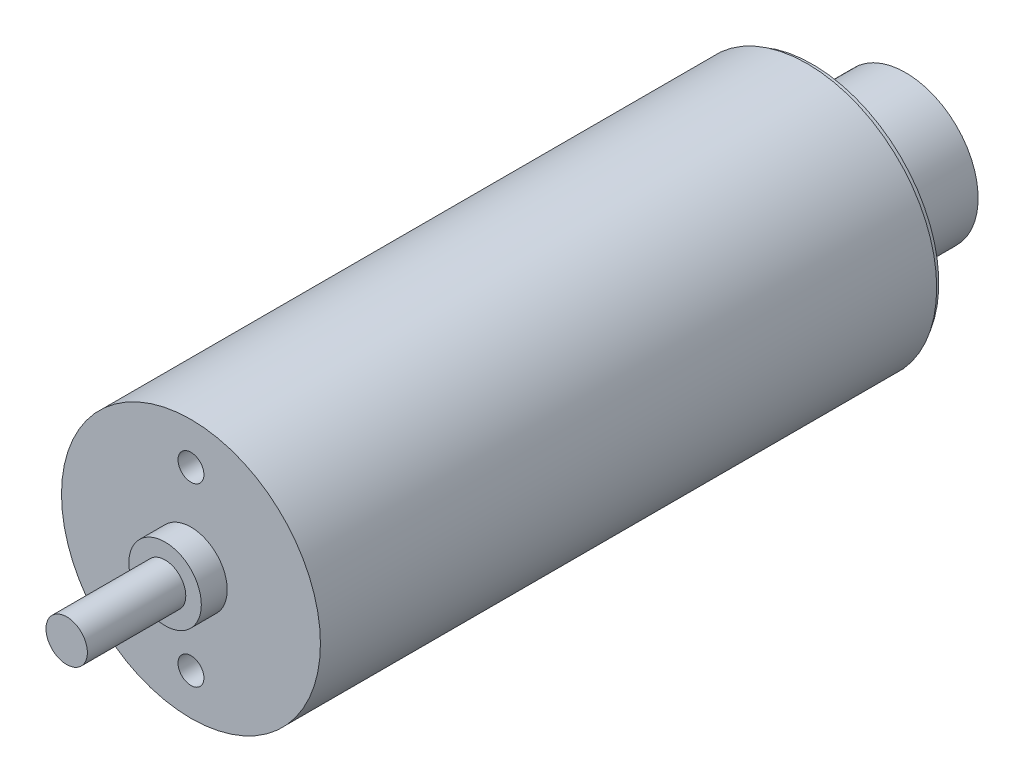
ISO-10303-21;
HEADER;
FILE_DESCRIPTION(('STEP AP214'),'2;1');
FILE_NAME('part.step','',(''),(''),'','','');
FILE_SCHEMA(('AUTOMOTIVE_DESIGN { 1 0 10303 214 1 1 1 1 }'));
ENDSEC;
DATA;
#1=APPLICATION_CONTEXT('core data for automotive mechanical design processes');
#2=APPLICATION_PROTOCOL_DEFINITION('international standard','automotive_design',2000,#1);
#3=PRODUCT_CONTEXT('',#1,'mechanical');
#4=PRODUCT('Part','Part','',(#3));
#5=PRODUCT_RELATED_PRODUCT_CATEGORY('part','',(#4));
#6=PRODUCT_DEFINITION_FORMATION('','',#4);
#7=PRODUCT_DEFINITION_CONTEXT('part definition',#1,'design');
#8=PRODUCT_DEFINITION('design','',#6,#7);
#9=PRODUCT_DEFINITION_SHAPE('','',#8);
#10=(LENGTH_UNIT() NAMED_UNIT(*) SI_UNIT(.MILLI.,.METRE.));
#11=(NAMED_UNIT(*) PLANE_ANGLE_UNIT() SI_UNIT($,.RADIAN.));
#12=(NAMED_UNIT(*) SI_UNIT($,.STERADIAN.) SOLID_ANGLE_UNIT());
#13=UNCERTAINTY_MEASURE_WITH_UNIT(LENGTH_MEASURE(1.E-05),#10,'distance_accuracy_value','');
#14=(GEOMETRIC_REPRESENTATION_CONTEXT(3) GLOBAL_UNCERTAINTY_ASSIGNED_CONTEXT((#13)) GLOBAL_UNIT_ASSIGNED_CONTEXT((#10,
#11,#12)) REPRESENTATION_CONTEXT('',''));
#15=CARTESIAN_POINT('',(0.,0.,0.));
#16=DIRECTION('',(0.,0.,1.));
#17=DIRECTION('',(1.,0.,0.));
#18=AXIS2_PLACEMENT_3D('',#15,#16,#17);
#19=CARTESIAN_POINT('',(0.,0.,-60.));
#20=DIRECTION('',(0.,0.,1.));
#21=DIRECTION('',(1.,0.,0.));
#22=AXIS2_PLACEMENT_3D('',#19,#20,#21);
#23=CYLINDRICAL_SURFACE('',#22,12.5);
#24=CARTESIAN_POINT('',(0.,0.,0.));
#25=DIRECTION('',(0.,0.,1.));
#26=DIRECTION('',(1.,0.,0.));
#27=AXIS2_PLACEMENT_3D('',#24,#25,#26);
#28=CIRCLE('',#27,12.5);
#29=CARTESIAN_POINT('',(12.5,0.,0.));
#30=VERTEX_POINT('',#29);
#31=EDGE_CURVE('E90',#30,#30,#28,.T.);
#32=ORIENTED_EDGE('',*,*,#31,.F.);
#33=EDGE_LOOP('',(#32));
#34=FACE_BOUND('',#33,.T.);
#35=CARTESIAN_POINT('',(0.,0.,-59.5));
#36=DIRECTION('',(0.,0.,-1.));
#37=DIRECTION('',(-1.,0.,0.));
#38=AXIS2_PLACEMENT_3D('',#35,#36,#37);
#39=CIRCLE('',#38,12.5);
#40=CARTESIAN_POINT('',(-12.5,0.,-59.5));
#41=VERTEX_POINT('',#40);
#42=EDGE_CURVE('E78',#41,#41,#39,.T.);
#43=ORIENTED_EDGE('',*,*,#42,.F.);
#44=EDGE_LOOP('',(#43));
#45=FACE_BOUND('',#44,.T.);
#46=ADVANCED_FACE('F46',(#34,#45),#23,.T.);
#47=CARTESIAN_POINT('',(0.,0.,0.));
#48=DIRECTION('',(0.,0.,1.));
#49=DIRECTION('',(1.,0.,0.));
#50=AXIS2_PLACEMENT_3D('',#47,#48,#49);
#51=PLANE('',#50);
#52=CARTESIAN_POINT('',(0.,8.5,0.));
#53=DIRECTION('',(0.,0.,1.));
#54=DIRECTION('',(1.,0.,0.));
#55=AXIS2_PLACEMENT_3D('',#52,#53,#54);
#56=CIRCLE('',#55,1.24999999999999);
#57=CARTESIAN_POINT('',(1.24999999999999,8.5,0.));
#58=VERTEX_POINT('',#57);
#59=EDGE_CURVE('E72',#58,#58,#56,.T.);
#60=ORIENTED_EDGE('',*,*,#59,.F.);
#61=EDGE_LOOP('',(#60));
#62=FACE_BOUND('',#61,.T.);
#63=CARTESIAN_POINT('',(0.,-8.5,0.));
#64=DIRECTION('',(0.,0.,1.));
#65=DIRECTION('',(1.,0.,0.));
#66=AXIS2_PLACEMENT_3D('',#63,#64,#65);
#67=CIRCLE('',#66,1.24999999999999);
#68=CARTESIAN_POINT('',(1.24999999999999,-8.5,0.));
#69=VERTEX_POINT('',#68);
#70=EDGE_CURVE('E71',#69,#69,#67,.T.);
#71=ORIENTED_EDGE('',*,*,#70,.F.);
#72=EDGE_LOOP('',(#71));
#73=FACE_BOUND('',#72,.T.);
#74=CARTESIAN_POINT('',(0.,0.,0.));
#75=DIRECTION('',(0.,0.,1.));
#76=DIRECTION('',(1.,0.,0.));
#77=AXIS2_PLACEMENT_3D('',#74,#75,#76);
#78=CIRCLE('',#77,3.5);
#79=CARTESIAN_POINT('',(3.5,0.,0.));
#80=VERTEX_POINT('',#79);
#81=EDGE_CURVE('E54',#80,#80,#78,.T.);
#82=ORIENTED_EDGE('',*,*,#81,.F.);
#83=EDGE_LOOP('',(#82));
#84=FACE_BOUND('',#83,.T.);
#85=ORIENTED_EDGE('',*,*,#31,.T.);
#86=EDGE_LOOP('',(#85));
#87=FACE_BOUND('',#86,.T.);
#88=ADVANCED_FACE('F95',(#62,#73,#84,#87),#51,.T.);
#89=CARTESIAN_POINT('',(0.,0.,2.5));
#90=DIRECTION('',(0.,0.,-1.));
#91=DIRECTION('',(-1.,0.,0.));
#92=AXIS2_PLACEMENT_3D('',#89,#90,#91);
#93=CYLINDRICAL_SURFACE('',#92,3.5);
#94=CARTESIAN_POINT('',(0.,0.,2.5));
#95=DIRECTION('',(0.,0.,1.));
#96=DIRECTION('',(1.,0.,0.));
#97=AXIS2_PLACEMENT_3D('',#94,#95,#96);
#98=CIRCLE('',#97,3.5);
#99=CARTESIAN_POINT('',(3.5,0.,2.5));
#100=VERTEX_POINT('',#99);
#101=EDGE_CURVE('E87',#100,#100,#98,.T.);
#102=ORIENTED_EDGE('',*,*,#101,.F.);
#103=EDGE_LOOP('',(#102));
#104=FACE_BOUND('',#103,.T.);
#105=ORIENTED_EDGE('',*,*,#81,.T.);
#106=EDGE_LOOP('',(#105));
#107=FACE_BOUND('',#106,.T.);
#108=ADVANCED_FACE('F158',(#104,#107),#93,.T.);
#109=CARTESIAN_POINT('',(0.,0.,2.5));
#110=DIRECTION('',(0.,0.,1.));
#111=DIRECTION('',(1.,0.,0.));
#112=AXIS2_PLACEMENT_3D('',#109,#110,#111);
#113=PLANE('',#112);
#114=CARTESIAN_POINT('',(0.,0.,2.5));
#115=DIRECTION('',(0.,0.,1.));
#116=DIRECTION('',(1.,0.,0.));
#117=AXIS2_PLACEMENT_3D('',#114,#115,#116);
#118=CIRCLE('',#117,2.);
#119=CARTESIAN_POINT('',(2.,0.,2.5));
#120=VERTEX_POINT('',#119);
#121=EDGE_CURVE('E49',#120,#120,#118,.F.);
#122=ORIENTED_EDGE('',*,*,#121,.T.);
#123=EDGE_LOOP('',(#122));
#124=FACE_BOUND('',#123,.T.);
#125=ORIENTED_EDGE('',*,*,#101,.T.);
#126=EDGE_LOOP('',(#125));
#127=FACE_BOUND('',#126,.T.);
#128=ADVANCED_FACE('F154',(#124,#127),#113,.T.);
#129=CARTESIAN_POINT('',(0.,0.,12.));
#130=DIRECTION('',(0.,0.,-1.));
#131=DIRECTION('',(-1.,0.,0.));
#132=AXIS2_PLACEMENT_3D('',#129,#130,#131);
#133=CYLINDRICAL_SURFACE('',#132,2.);
#134=ORIENTED_EDGE('',*,*,#121,.F.);
#135=EDGE_LOOP('',(#134));
#136=FACE_BOUND('',#135,.T.);
#137=CARTESIAN_POINT('',(0.,0.,12.));
#138=DIRECTION('',(0.,0.,1.));
#139=DIRECTION('',(1.,0.,0.));
#140=AXIS2_PLACEMENT_3D('',#137,#138,#139);
#141=CIRCLE('',#140,2.);
#142=CARTESIAN_POINT('',(2.,0.,12.));
#143=VERTEX_POINT('',#142);
#144=EDGE_CURVE('E84',#143,#143,#141,.T.);
#145=ORIENTED_EDGE('',*,*,#144,.F.);
#146=EDGE_LOOP('',(#145));
#147=FACE_BOUND('',#146,.T.);
#148=ADVANCED_FACE('F150',(#136,#147),#133,.T.);
#149=CARTESIAN_POINT('',(0.,0.,12.));
#150=DIRECTION('',(0.,0.,1.));
#151=DIRECTION('',(1.,0.,0.));
#152=AXIS2_PLACEMENT_3D('',#149,#150,#151);
#153=PLANE('',#152);
#154=ORIENTED_EDGE('',*,*,#144,.T.);
#155=EDGE_LOOP('',(#154));
#156=FACE_BOUND('',#155,.T.);
#157=ADVANCED_FACE('F147',(#156),#153,.T.);
#158=CARTESIAN_POINT('',(0.,-8.5,-4.99999));
#159=DIRECTION('',(0.,0.,1.));
#160=DIRECTION('',(1.,0.,0.));
#161=AXIS2_PLACEMENT_3D('',#158,#159,#160);
#162=CONICAL_SURFACE('',#161,1.24999999999999,1.02974425867665);
#163=CARTESIAN_POINT('',(0.,-8.5,-5.75106577378445));
#164=VERTEX_POINT('',#163);
#165=VERTEX_LOOP('',#164);
#166=FACE_BOUND('',#165,.T.);
#167=CARTESIAN_POINT('',(0.,-8.5,-4.99999));
#168=DIRECTION('',(0.,0.,1.));
#169=DIRECTION('',(1.,0.,0.));
#170=AXIS2_PLACEMENT_3D('',#167,#168,#169);
#171=CIRCLE('',#170,1.24999999999999);
#172=CARTESIAN_POINT('',(1.24999999999999,-8.5,-4.99999));
#173=VERTEX_POINT('',#172);
#174=EDGE_CURVE('E75',#173,#173,#171,.T.);
#175=ORIENTED_EDGE('',*,*,#174,.T.);
#176=EDGE_LOOP('',(#175));
#177=FACE_BOUND('',#176,.T.);
#178=ADVANCED_FACE('F143',(#166,#177),#162,.F.);
#179=CARTESIAN_POINT('',(0.,-8.5,0.));
#180=DIRECTION('',(0.,0.,1.));
#181=DIRECTION('',(1.,0.,0.));
#182=AXIS2_PLACEMENT_3D('',#179,#180,#181);
#183=CYLINDRICAL_SURFACE('',#182,1.24999999999999);
#184=ORIENTED_EDGE('',*,*,#174,.F.);
#185=EDGE_LOOP('',(#184));
#186=FACE_BOUND('',#185,.T.);
#187=ORIENTED_EDGE('',*,*,#70,.T.);
#188=EDGE_LOOP('',(#187));
#189=FACE_BOUND('',#188,.T.);
#190=ADVANCED_FACE('F65',(#186,#189),#183,.F.);
#191=CARTESIAN_POINT('',(0.,8.5,-4.99999));
#192=DIRECTION('',(0.,0.,1.));
#193=DIRECTION('',(1.,0.,0.));
#194=AXIS2_PLACEMENT_3D('',#191,#192,#193);
#195=CONICAL_SURFACE('',#194,1.24999999999999,1.02974425867665);
#196=CARTESIAN_POINT('',(0.,8.5,-5.75106577378445));
#197=VERTEX_POINT('',#196);
#198=VERTEX_LOOP('',#197);
#199=FACE_BOUND('',#198,.T.);
#200=CARTESIAN_POINT('',(0.,8.5,-4.99999));
#201=DIRECTION('',(0.,0.,1.));
#202=DIRECTION('',(1.,0.,0.));
#203=AXIS2_PLACEMENT_3D('',#200,#201,#202);
#204=CIRCLE('',#203,1.24999999999999);
#205=CARTESIAN_POINT('',(1.24999999999999,8.5,-4.99999));
#206=VERTEX_POINT('',#205);
#207=EDGE_CURVE('E69',#206,#206,#204,.T.);
#208=ORIENTED_EDGE('',*,*,#207,.T.);
#209=EDGE_LOOP('',(#208));
#210=FACE_BOUND('',#209,.T.);
#211=ADVANCED_FACE('F61',(#199,#210),#195,.F.);
#212=CARTESIAN_POINT('',(0.,8.5,0.));
#213=DIRECTION('',(0.,0.,1.));
#214=DIRECTION('',(1.,0.,0.));
#215=AXIS2_PLACEMENT_3D('',#212,#213,#214);
#216=CYLINDRICAL_SURFACE('',#215,1.24999999999999);
#217=ORIENTED_EDGE('',*,*,#207,.F.);
#218=EDGE_LOOP('',(#217));
#219=FACE_BOUND('',#218,.T.);
#220=ORIENTED_EDGE('',*,*,#59,.T.);
#221=EDGE_LOOP('',(#220));
#222=FACE_BOUND('',#221,.T.);
#223=ADVANCED_FACE('F64',(#219,#222),#216,.F.);
#224=CARTESIAN_POINT('',(0.,0.,-59.5));
#225=DIRECTION('',(0.,0.,-1.));
#226=DIRECTION('',(-1.,0.,0.));
#227=AXIS2_PLACEMENT_3D('',#224,#225,#226);
#228=PLANE('',#227);
#229=CARTESIAN_POINT('',(0.,0.,-59.5));
#230=DIRECTION('',(0.,0.,-1.));
#231=DIRECTION('',(-1.,0.,0.));
#232=AXIS2_PLACEMENT_3D('',#229,#230,#231);
#233=CIRCLE('',#232,12.2);
#234=CARTESIAN_POINT('',(-12.2,0.,-59.5));
#235=VERTEX_POINT('',#234);
#236=EDGE_CURVE('E102',#235,#235,#233,.T.);
#237=ORIENTED_EDGE('',*,*,#236,.F.);
#238=EDGE_LOOP('',(#237));
#239=FACE_BOUND('',#238,.T.);
#240=ORIENTED_EDGE('',*,*,#42,.T.);
#241=EDGE_LOOP('',(#240));
#242=FACE_BOUND('',#241,.T.);
#243=ADVANCED_FACE('F129',(#239,#242),#228,.T.);
#244=CARTESIAN_POINT('',(0.,0.,-59.5));
#245=DIRECTION('',(0.,0.,-1.));
#246=DIRECTION('',(-1.,0.,0.));
#247=AXIS2_PLACEMENT_3D('',#244,#245,#246);
#248=CYLINDRICAL_SURFACE('',#247,12.2);
#249=ORIENTED_EDGE('',*,*,#236,.T.);
#250=EDGE_LOOP('',(#249));
#251=FACE_BOUND('',#250,.T.);
#252=CARTESIAN_POINT('',(0.,0.,-60.));
#253=DIRECTION('',(0.,0.,-1.));
#254=DIRECTION('',(-1.,0.,0.));
#255=AXIS2_PLACEMENT_3D('',#252,#253,#254);
#256=CIRCLE('',#255,12.2);
#257=CARTESIAN_POINT('',(-12.2,0.,-60.));
#258=VERTEX_POINT('',#257);
#259=EDGE_CURVE('E104',#258,#258,#256,.T.);
#260=ORIENTED_EDGE('',*,*,#259,.F.);
#261=EDGE_LOOP('',(#260));
#262=FACE_BOUND('',#261,.T.);
#263=ADVANCED_FACE('F124',(#251,#262),#248,.T.);
#264=CARTESIAN_POINT('',(0.,0.,-60.));
#265=DIRECTION('',(0.,0.,1.));
#266=DIRECTION('',(1.,0.,0.));
#267=AXIS2_PLACEMENT_3D('',#264,#265,#266);
#268=PLANE('',#267);
#269=CARTESIAN_POINT('',(0.,0.,-60.));
#270=DIRECTION('',(0.,0.,-1.));
#271=DIRECTION('',(-1.,0.,0.));
#272=AXIS2_PLACEMENT_3D('',#269,#270,#271);
#273=CIRCLE('',#272,7.);
#274=CARTESIAN_POINT('',(-7.,0.,-60.));
#275=VERTEX_POINT('',#274);
#276=EDGE_CURVE('E12',#275,#275,#273,.T.);
#277=ORIENTED_EDGE('',*,*,#276,.F.);
#278=EDGE_LOOP('',(#277));
#279=FACE_BOUND('',#278,.T.);
#280=ORIENTED_EDGE('',*,*,#259,.T.);
#281=EDGE_LOOP('',(#280));
#282=FACE_BOUND('',#281,.T.);
#283=ADVANCED_FACE('F118',(#279,#282),#268,.F.);
#284=CARTESIAN_POINT('',(0.,0.,-69.));
#285=DIRECTION('',(0.,0.,1.));
#286=DIRECTION('',(1.,0.,0.));
#287=AXIS2_PLACEMENT_3D('',#284,#285,#286);
#288=CYLINDRICAL_SURFACE('',#287,7.);
#289=CARTESIAN_POINT('',(0.,0.,-69.));
#290=DIRECTION('',(0.,0.,-1.));
#291=DIRECTION('',(-1.,0.,0.));
#292=AXIS2_PLACEMENT_3D('',#289,#290,#291);
#293=CIRCLE('',#292,7.);
#294=CARTESIAN_POINT('',(-7.,0.,-69.));
#295=VERTEX_POINT('',#294);
#296=EDGE_CURVE('E108',#295,#295,#293,.T.);
#297=ORIENTED_EDGE('',*,*,#296,.F.);
#298=EDGE_LOOP('',(#297));
#299=FACE_BOUND('',#298,.T.);
#300=ORIENTED_EDGE('',*,*,#276,.T.);
#301=EDGE_LOOP('',(#300));
#302=FACE_BOUND('',#301,.T.);
#303=ADVANCED_FACE('F115',(#299,#302),#288,.T.);
#304=CARTESIAN_POINT('',(0.,0.,-69.));
#305=DIRECTION('',(0.,0.,-1.));
#306=DIRECTION('',(-1.,0.,0.));
#307=AXIS2_PLACEMENT_3D('',#304,#305,#306);
#308=PLANE('',#307);
#309=ORIENTED_EDGE('',*,*,#296,.T.);
#310=EDGE_LOOP('',(#309));
#311=FACE_BOUND('',#310,.T.);
#312=ADVANCED_FACE('F113',(#311),#308,.T.);
#313=CLOSED_SHELL('',(#46,#88,#108,#128,#148,#157,#178,#190,#211,#223,#243,#263,#283,#303,#312));
#314=MANIFOLD_SOLID_BREP('B2',#313);
#315=ADVANCED_BREP_SHAPE_REPRESENTATION('',(#18,#314),#14);
#316=SHAPE_DEFINITION_REPRESENTATION(#9,#315);
ENDSEC;
END-ISO-10303-21;
